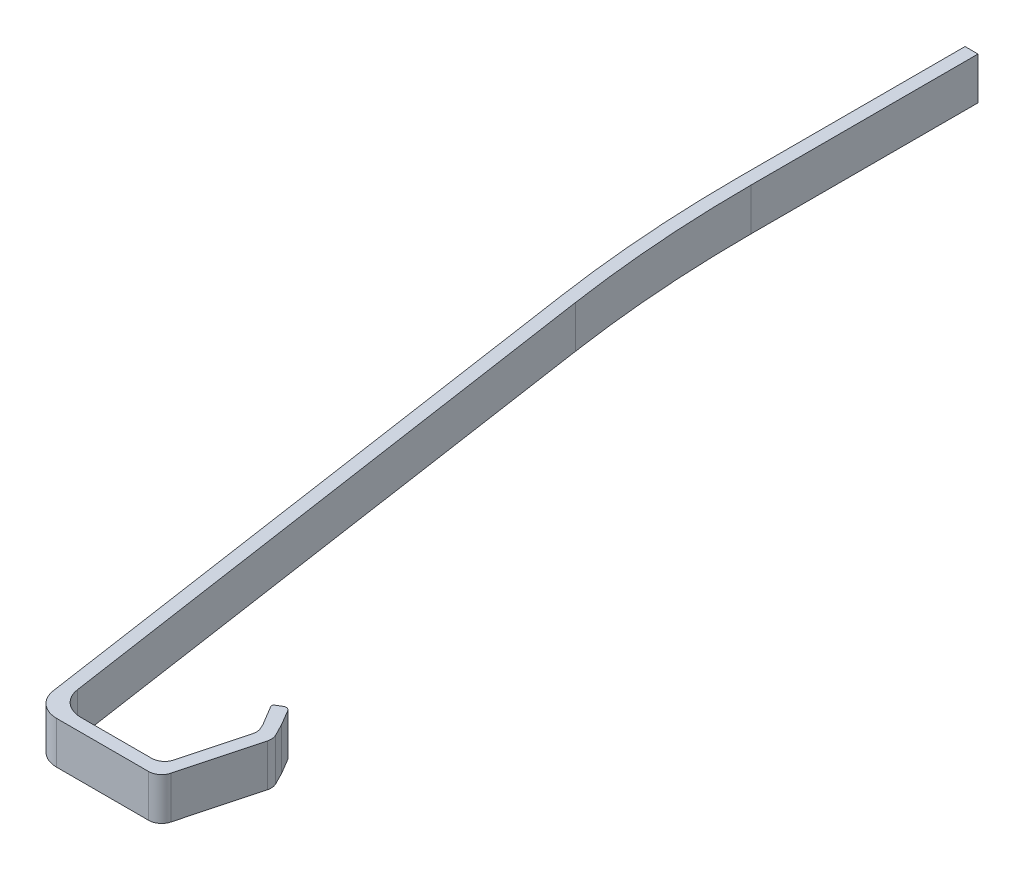
ISO-10303-21;
HEADER;
FILE_DESCRIPTION(('STEP AP214'),'2;1');
FILE_NAME('part.step','',(''),(''),'','','');
FILE_SCHEMA(('AUTOMOTIVE_DESIGN { 1 0 10303 214 1 1 1 1 }'));
ENDSEC;
DATA;
#1=APPLICATION_CONTEXT('core data for automotive mechanical design processes');
#2=APPLICATION_PROTOCOL_DEFINITION('international standard','automotive_design',2000,#1);
#3=PRODUCT_CONTEXT('',#1,'mechanical');
#4=PRODUCT('Part','Part','',(#3));
#5=PRODUCT_RELATED_PRODUCT_CATEGORY('part','',(#4));
#6=PRODUCT_DEFINITION_FORMATION('','',#4);
#7=PRODUCT_DEFINITION_CONTEXT('part definition',#1,'design');
#8=PRODUCT_DEFINITION('design','',#6,#7);
#9=PRODUCT_DEFINITION_SHAPE('','',#8);
#10=(LENGTH_UNIT() NAMED_UNIT(*) SI_UNIT(.MILLI.,.METRE.));
#11=(NAMED_UNIT(*) PLANE_ANGLE_UNIT() SI_UNIT($,.RADIAN.));
#12=(NAMED_UNIT(*) SI_UNIT($,.STERADIAN.) SOLID_ANGLE_UNIT());
#13=UNCERTAINTY_MEASURE_WITH_UNIT(LENGTH_MEASURE(1.E-05),#10,'distance_accuracy_value','');
#14=(GEOMETRIC_REPRESENTATION_CONTEXT(3) GLOBAL_UNCERTAINTY_ASSIGNED_CONTEXT((#13)) GLOBAL_UNIT_ASSIGNED_CONTEXT((#10,
#11,#12)) REPRESENTATION_CONTEXT('',''));
#15=CARTESIAN_POINT('',(0.,0.,0.));
#16=DIRECTION('',(0.,0.,1.));
#17=DIRECTION('',(1.,0.,0.));
#18=AXIS2_PLACEMENT_3D('',#15,#16,#17);
#19=CARTESIAN_POINT('',(63.534236003317,-4.9,267.529669295399));
#20=DIRECTION('',(0.,1.,0.));
#21=DIRECTION('',(0.,0.,1.));
#22=AXIS2_PLACEMENT_3D('',#19,#20,#21);
#23=CYLINDRICAL_SURFACE('',#22,0.500000000000008);
#24=DIRECTION('',(0.,1.,0.));
#25=VECTOR('',#24,1.);
#26=CARTESIAN_POINT('',(63.1054895404607,-4.9,267.786917173113));
#27=LINE('',#26,#25);
#28=CARTESIAN_POINT('',(63.1054895404607,-4.9,267.786917173113));
#29=VERTEX_POINT('',#28);
#30=CARTESIAN_POINT('',(63.1054895404607,4.9,267.786917173113));
#31=VERTEX_POINT('',#30);
#32=EDGE_CURVE('E44',#29,#31,#27,.T.);
#33=ORIENTED_EDGE('',*,*,#32,.T.);
#34=CARTESIAN_POINT('',(63.534236003317,4.9,267.529669295399));
#35=DIRECTION('',(0.,1.,0.));
#36=DIRECTION('',(0.,0.,1.));
#37=AXIS2_PLACEMENT_3D('',#34,#35,#36);
#38=CIRCLE('',#37,0.500000000000008);
#39=CARTESIAN_POINT('',(63.2769881256033,4.9,267.100922832543));
#40=VERTEX_POINT('',#39);
#41=EDGE_CURVE('E209',#31,#40,#38,.F.);
#42=ORIENTED_EDGE('',*,*,#41,.T.);
#43=DIRECTION('',(0.,1.,0.));
#44=VECTOR('',#43,1.);
#45=CARTESIAN_POINT('',(63.2769881256033,-4.9,267.100922832543));
#46=LINE('',#45,#44);
#47=CARTESIAN_POINT('',(63.2769881256033,-4.9,267.100922832543));
#48=VERTEX_POINT('',#47);
#49=EDGE_CURVE('E11',#48,#40,#46,.T.);
#50=ORIENTED_EDGE('',*,*,#49,.F.);
#51=CARTESIAN_POINT('',(63.534236003317,-4.9,267.529669295399));
#52=DIRECTION('',(0.,1.,0.));
#53=DIRECTION('',(0.,0.,1.));
#54=AXIS2_PLACEMENT_3D('',#51,#52,#53);
#55=CIRCLE('',#54,0.500000000000008);
#56=EDGE_CURVE('E211',#29,#48,#55,.F.);
#57=ORIENTED_EDGE('',*,*,#56,.F.);
#58=EDGE_LOOP('',(#33,#42,#50,#57));
#59=FACE_BOUND('',#58,.T.);
#60=ADVANCED_FACE('F41',(#59),#23,.T.);
#61=CARTESIAN_POINT('',(134.588433400539,-4.9,224.314055667585));
#62=DIRECTION('',(0.514495755427491,0.,0.857492925712565));
#63=DIRECTION('',(0.857492925712566,0.,-0.514495755427491));
#64=AXIS2_PLACEMENT_3D('',#61,#62,#63);
#65=PLANE('',#64);
#66=ORIENTED_EDGE('',*,*,#49,.T.);
#67=DIRECTION('',(0.857492925712566,0.,-0.514495755427491));
#68=VECTOR('',#67,1.);
#69=CARTESIAN_POINT('',(134.588433400539,4.9,224.314055667585));
#70=LINE('',#69,#68);
#71=CARTESIAN_POINT('',(64.5571730263446,4.9,266.332811892098));
#72=VERTEX_POINT('',#71);
#73=EDGE_CURVE('E224',#40,#72,#70,.T.);
#74=ORIENTED_EDGE('',*,*,#73,.T.);
#75=DIRECTION('',(0.,1.,0.));
#76=VECTOR('',#75,1.);
#77=CARTESIAN_POINT('',(64.5571730263446,-4.9,266.332811892098));
#78=LINE('',#77,#76);
#79=CARTESIAN_POINT('',(64.5571730263446,-4.9,266.332811892098));
#80=VERTEX_POINT('',#79);
#81=EDGE_CURVE('E49',#80,#72,#78,.T.);
#82=ORIENTED_EDGE('',*,*,#81,.F.);
#83=DIRECTION('',(0.857492925712566,0.,-0.514495755427491));
#84=VECTOR('',#83,1.);
#85=CARTESIAN_POINT('',(134.588433400539,-4.9,224.314055667585));
#86=LINE('',#85,#84);
#87=EDGE_CURVE('E56',#48,#80,#86,.T.);
#88=ORIENTED_EDGE('',*,*,#87,.F.);
#89=EDGE_LOOP('',(#66,#74,#82,#88));
#90=FACE_BOUND('',#89,.T.);
#91=ADVANCED_FACE('F489',(#90),#65,.F.);
#92=CARTESIAN_POINT('',(65.0716687817721,-4.9,267.19030481781));
#93=DIRECTION('',(0.,1.,0.));
#94=DIRECTION('',(0.,0.,1.));
#95=AXIS2_PLACEMENT_3D('',#92,#93,#94);
#96=CYLINDRICAL_SURFACE('',#95,0.99999999999999);
#97=ORIENTED_EDGE('',*,*,#81,.T.);
#98=CARTESIAN_POINT('',(65.0716687817721,4.9,267.19030481781));
#99=DIRECTION('',(0.,1.,0.));
#100=DIRECTION('',(0.,0.,1.));
#101=AXIS2_PLACEMENT_3D('',#98,#99,#100);
#102=CIRCLE('',#101,0.99999999999999);
#103=CARTESIAN_POINT('',(65.9327603518165,4.9,266.681854910741));
#104=VERTEX_POINT('',#103);
#105=EDGE_CURVE('E292',#104,#72,#102,.T.);
#106=ORIENTED_EDGE('',*,*,#105,.F.);
#107=DIRECTION('',(0.,1.,0.));
#108=VECTOR('',#107,1.);
#109=CARTESIAN_POINT('',(65.9327603518165,-4.9,266.681854910741));
#110=LINE('',#109,#108);
#111=CARTESIAN_POINT('',(65.9327603518165,-4.9,266.681854910741));
#112=VERTEX_POINT('',#111);
#113=EDGE_CURVE('E355',#112,#104,#110,.T.);
#114=ORIENTED_EDGE('',*,*,#113,.F.);
#115=CARTESIAN_POINT('',(65.0716687817721,-4.9,267.19030481781));
#116=DIRECTION('',(0.,1.,0.));
#117=DIRECTION('',(0.,0.,1.));
#118=AXIS2_PLACEMENT_3D('',#115,#116,#117);
#119=CIRCLE('',#118,0.99999999999999);
#120=EDGE_CURVE('E350',#112,#80,#119,.T.);
#121=ORIENTED_EDGE('',*,*,#120,.T.);
#122=EDGE_LOOP('',(#97,#106,#114,#121));
#123=FACE_BOUND('',#122,.T.);
#124=ADVANCED_FACE('F488',(#123),#96,.T.);
#125=CARTESIAN_POINT('',(-67.8714271784815,-4.9,40.0761336448447));
#126=DIRECTION('',(0.861091570044339,0.,-0.508449907069099));
#127=DIRECTION('',(-0.508449907069099,0.,-0.861091570044339));
#128=AXIS2_PLACEMENT_3D('',#125,#126,#127);
#129=PLANE('',#128);
#130=ORIENTED_EDGE('',*,*,#113,.T.);
#131=DIRECTION('',(-0.508449907069099,0.,-0.861091570044339));
#132=VECTOR('',#131,1.);
#133=CARTESIAN_POINT('',(-67.8714271784815,4.9,40.0761336448447));
#134=LINE('',#133,#132);
#135=CARTESIAN_POINT('',(67.9984661847248,4.9,270.180256334713));
#136=VERTEX_POINT('',#135);
#137=EDGE_CURVE('E289',#136,#104,#134,.T.);
#138=ORIENTED_EDGE('',*,*,#137,.F.);
#139=DIRECTION('',(0.,1.,0.));
#140=VECTOR('',#139,1.);
#141=CARTESIAN_POINT('',(67.9984661847248,-4.9,270.180256334713));
#142=LINE('',#141,#140);
#143=CARTESIAN_POINT('',(67.9984661847248,-4.9,270.180256334713));
#144=VERTEX_POINT('',#143);
#145=EDGE_CURVE('E357',#144,#136,#142,.T.);
#146=ORIENTED_EDGE('',*,*,#145,.F.);
#147=DIRECTION('',(-0.508449907069099,0.,-0.861091570044339));
#148=VECTOR('',#147,1.);
#149=CARTESIAN_POINT('',(-67.8714271784815,-4.9,40.0761336448447));
#150=LINE('',#149,#148);
#151=EDGE_CURVE('E347',#144,#112,#150,.T.);
#152=ORIENTED_EDGE('',*,*,#151,.T.);
#153=EDGE_LOOP('',(#130,#138,#146,#152));
#154=FACE_BOUND('',#153,.T.);
#155=ADVANCED_FACE('F485',(#154),#129,.T.);
#156=CARTESIAN_POINT('',(-55.1862828881438,-4.9,28.0796879363563));
#157=DIRECTION('',(-0.891261997613539,0.,0.453488755770111));
#158=DIRECTION('',(0.453488755770111,0.,0.89126199761354));
#159=AXIS2_PLACEMENT_3D('',#156,#157,#158);
#160=PLANE('',#159);
#161=ORIENTED_EDGE('',*,*,#145,.T.);
#162=DIRECTION('',(0.453488755770111,0.,0.891261997613539));
#163=VECTOR('',#162,1.);
#164=CARTESIAN_POINT('',(-55.1862828881438,4.9,28.0796879363563));
#165=LINE('',#164,#163);
#166=CARTESIAN_POINT('',(69.4209408448456,4.9,272.975910231315));
#167=VERTEX_POINT('',#166);
#168=EDGE_CURVE('E286',#136,#167,#165,.T.);
#169=ORIENTED_EDGE('',*,*,#168,.T.);
#170=DIRECTION('',(0.,1.,0.));
#171=VECTOR('',#170,1.);
#172=CARTESIAN_POINT('',(69.4209408448456,-4.9,272.975910231315));
#173=LINE('',#172,#171);
#174=CARTESIAN_POINT('',(69.4209408448456,-4.9,272.975910231315));
#175=VERTEX_POINT('',#174);
#176=EDGE_CURVE('E359',#175,#167,#173,.T.);
#177=ORIENTED_EDGE('',*,*,#176,.F.);
#178=DIRECTION('',(0.453488755770111,0.,0.891261997613539));
#179=VECTOR('',#178,1.);
#180=CARTESIAN_POINT('',(-55.1862828881438,-4.9,28.0796879363563));
#181=LINE('',#180,#179);
#182=EDGE_CURVE('E345',#144,#175,#181,.T.);
#183=ORIENTED_EDGE('',*,*,#182,.F.);
#184=EDGE_LOOP('',(#161,#169,#177,#183));
#185=FACE_BOUND('',#184,.T.);
#186=ADVANCED_FACE('F480',(#185),#160,.F.);
#187=CARTESIAN_POINT('',(66.7471548520051,-4.9,274.336376498625));
#188=DIRECTION('',(0.,1.,0.));
#189=DIRECTION('',(0.,0.,1.));
#190=AXIS2_PLACEMENT_3D('',#187,#188,#189);
#191=CYLINDRICAL_SURFACE('',#190,2.99999999999995);
#192=ORIENTED_EDGE('',*,*,#176,.T.);
#193=CARTESIAN_POINT('',(66.7471548520051,4.9,274.336376498625));
#194=DIRECTION('',(0.,1.,0.));
#195=DIRECTION('',(0.,0.,1.));
#196=AXIS2_PLACEMENT_3D('',#193,#194,#195);
#197=CIRCLE('',#196,2.99999999999995);
#198=CARTESIAN_POINT('',(69.6458255608125,4.9,275.109492351459));
#199=VERTEX_POINT('',#198);
#200=EDGE_CURVE('E283',#199,#167,#197,.T.);
#201=ORIENTED_EDGE('',*,*,#200,.F.);
#202=DIRECTION('',(0.,1.,0.));
#203=VECTOR('',#202,1.);
#204=CARTESIAN_POINT('',(69.6458255608125,-4.9,275.109492351459));
#205=LINE('',#204,#203);
#206=CARTESIAN_POINT('',(69.6458255608125,-4.9,275.109492351459));
#207=VERTEX_POINT('',#206);
#208=EDGE_CURVE('E361',#207,#199,#205,.T.);
#209=ORIENTED_EDGE('',*,*,#208,.F.);
#210=CARTESIAN_POINT('',(66.7471548520051,-4.9,274.336376498625));
#211=DIRECTION('',(0.,1.,0.));
#212=DIRECTION('',(0.,0.,1.));
#213=AXIS2_PLACEMENT_3D('',#210,#211,#212);
#214=CIRCLE('',#213,2.99999999999995);
#215=EDGE_CURVE('E342',#207,#175,#214,.T.);
#216=ORIENTED_EDGE('',*,*,#215,.T.);
#217=EDGE_LOOP('',(#192,#201,#209,#216));
#218=FACE_BOUND('',#217,.T.);
#219=ADVANCED_FACE('F504',(#218),#191,.T.);
#220=CARTESIAN_POINT('',(133.523022658624,-4.9,35.6124499488499));
#221=DIRECTION('',(-0.966223569602459,0.,-0.257705284277761));
#222=DIRECTION('',(-0.257705284277761,0.,0.966223569602459));
#223=AXIS2_PLACEMENT_3D('',#220,#221,#222);
#224=PLANE('',#223);
#225=ORIENTED_EDGE('',*,*,#208,.T.);
#226=DIRECTION('',(-0.257705284277761,0.,0.966223569602459));
#227=VECTOR('',#226,1.);
#228=CARTESIAN_POINT('',(133.523022658624,4.9,35.6124499488499));
#229=LINE('',#228,#227);
#230=CARTESIAN_POINT('',(64.9346911411979,4.9,292.773115852833));
#231=VERTEX_POINT('',#230);
#232=EDGE_CURVE('E280',#199,#231,#229,.T.);
#233=ORIENTED_EDGE('',*,*,#232,.T.);
#234=DIRECTION('',(0.,1.,0.));
#235=VECTOR('',#234,1.);
#236=CARTESIAN_POINT('',(64.9346911411979,-4.9,292.773115852833));
#237=LINE('',#236,#235);
#238=CARTESIAN_POINT('',(64.9346911411979,-4.9,292.773115852833));
#239=VERTEX_POINT('',#238);
#240=EDGE_CURVE('E363',#239,#231,#237,.T.);
#241=ORIENTED_EDGE('',*,*,#240,.F.);
#242=DIRECTION('',(-0.257705284277761,0.,0.966223569602459));
#243=VECTOR('',#242,1.);
#244=CARTESIAN_POINT('',(133.523022658624,-4.9,35.6124499488499));
#245=LINE('',#244,#243);
#246=EDGE_CURVE('E340',#207,#239,#245,.T.);
#247=ORIENTED_EDGE('',*,*,#246,.F.);
#248=EDGE_LOOP('',(#225,#233,#241,#247));
#249=FACE_BOUND('',#248,.T.);
#250=ADVANCED_FACE('F473',(#249),#224,.F.);
#251=CARTESIAN_POINT('',(62.0360204323905,-4.9,292.));
#252=DIRECTION('',(0.,1.,0.));
#253=DIRECTION('',(0.,0.,1.));
#254=AXIS2_PLACEMENT_3D('',#251,#252,#253);
#255=CYLINDRICAL_SURFACE('',#254,3.00000000000001);
#256=ORIENTED_EDGE('',*,*,#240,.T.);
#257=CARTESIAN_POINT('',(62.0360204323905,4.9,292.));
#258=DIRECTION('',(0.,1.,0.));
#259=DIRECTION('',(0.,0.,1.));
#260=AXIS2_PLACEMENT_3D('',#257,#258,#259);
#261=CIRCLE('',#260,3.00000000000001);
#262=CARTESIAN_POINT('',(62.0360204323904,4.9,295.));
#263=VERTEX_POINT('',#262);
#264=EDGE_CURVE('E277',#263,#231,#261,.T.);
#265=ORIENTED_EDGE('',*,*,#264,.F.);
#266=DIRECTION('',(0.,1.,0.));
#267=VECTOR('',#266,1.);
#268=CARTESIAN_POINT('',(62.0360204323904,-4.9,295.));
#269=LINE('',#268,#267);
#270=CARTESIAN_POINT('',(62.0360204323904,-4.9,295.));
#271=VERTEX_POINT('',#270);
#272=EDGE_CURVE('E365',#271,#263,#269,.T.);
#273=ORIENTED_EDGE('',*,*,#272,.F.);
#274=CARTESIAN_POINT('',(62.0360204323905,-4.9,292.));
#275=DIRECTION('',(0.,1.,0.));
#276=DIRECTION('',(0.,0.,1.));
#277=AXIS2_PLACEMENT_3D('',#274,#275,#276);
#278=CIRCLE('',#277,3.00000000000001);
#279=EDGE_CURVE('E337',#271,#239,#278,.T.);
#280=ORIENTED_EDGE('',*,*,#279,.T.);
#281=EDGE_LOOP('',(#256,#265,#273,#280));
#282=FACE_BOUND('',#281,.T.);
#283=ADVANCED_FACE('F468',(#282),#255,.T.);
#284=CARTESIAN_POINT('',(0.,-4.9,295.));
#285=DIRECTION('',(0.,0.,1.));
#286=DIRECTION('',(1.,0.,0.));
#287=AXIS2_PLACEMENT_3D('',#284,#285,#286);
#288=PLANE('',#287);
#289=ORIENTED_EDGE('',*,*,#272,.T.);
#290=DIRECTION('',(1.,0.,0.));
#291=VECTOR('',#290,1.);
#292=CARTESIAN_POINT('',(0.,4.9,295.));
#293=LINE('',#292,#291);
#294=CARTESIAN_POINT('',(40.7187262352657,4.9,295.));
#295=VERTEX_POINT('',#294);
#296=EDGE_CURVE('E274',#295,#263,#293,.T.);
#297=ORIENTED_EDGE('',*,*,#296,.F.);
#298=DIRECTION('',(0.,1.,0.));
#299=VECTOR('',#298,1.);
#300=CARTESIAN_POINT('',(40.7187262352657,-4.9,295.));
#301=LINE('',#300,#299);
#302=CARTESIAN_POINT('',(40.7187262352657,-4.9,295.));
#303=VERTEX_POINT('',#302);
#304=EDGE_CURVE('E367',#303,#295,#301,.T.);
#305=ORIENTED_EDGE('',*,*,#304,.F.);
#306=DIRECTION('',(1.,0.,0.));
#307=VECTOR('',#306,1.);
#308=CARTESIAN_POINT('',(0.,-4.9,295.));
#309=LINE('',#308,#307);
#310=EDGE_CURVE('E334',#303,#271,#309,.T.);
#311=ORIENTED_EDGE('',*,*,#310,.T.);
#312=EDGE_LOOP('',(#289,#297,#305,#311));
#313=FACE_BOUND('',#312,.T.);
#314=ADVANCED_FACE('F466',(#313),#288,.T.);
#315=CARTESIAN_POINT('',(40.7187262352656,-4.9,289.));
#316=DIRECTION('',(0.,1.,0.));
#317=DIRECTION('',(0.,0.,1.));
#318=AXIS2_PLACEMENT_3D('',#315,#316,#317);
#319=CYLINDRICAL_SURFACE('',#318,6.00000000000001);
#320=ORIENTED_EDGE('',*,*,#304,.T.);
#321=CARTESIAN_POINT('',(40.7187262352656,4.9,289.));
#322=DIRECTION('',(0.,1.,0.));
#323=DIRECTION('',(0.,0.,1.));
#324=AXIS2_PLACEMENT_3D('',#321,#322,#323);
#325=CIRCLE('',#324,6.00000000000001);
#326=CARTESIAN_POINT('',(34.7831474096627,4.9,289.876871715278));
#327=VERTEX_POINT('',#326);
#328=EDGE_CURVE('E271',#327,#295,#325,.T.);
#329=ORIENTED_EDGE('',*,*,#328,.F.);
#330=DIRECTION('',(0.,1.,0.));
#331=VECTOR('',#330,1.);
#332=CARTESIAN_POINT('',(34.7831474096627,-4.9,289.876871715278));
#333=LINE('',#332,#331);
#334=CARTESIAN_POINT('',(34.7831474096627,-4.9,289.876871715278));
#335=VERTEX_POINT('',#334);
#336=EDGE_CURVE('E369',#335,#327,#333,.T.);
#337=ORIENTED_EDGE('',*,*,#336,.F.);
#338=CARTESIAN_POINT('',(40.7187262352656,-4.9,289.));
#339=DIRECTION('',(0.,1.,0.));
#340=DIRECTION('',(0.,0.,1.));
#341=AXIS2_PLACEMENT_3D('',#338,#339,#340);
#342=CIRCLE('',#341,6.00000000000001);
#343=EDGE_CURVE('E331',#335,#303,#342,.T.);
#344=ORIENTED_EDGE('',*,*,#343,.T.);
#345=EDGE_LOOP('',(#320,#329,#337,#344));
#346=FACE_BOUND('',#345,.T.);
#347=ADVANCED_FACE('F461',(#346),#319,.T.);
#348=CARTESIAN_POINT('',(-7.86904688003991,-4.9,1.16250577037894));
#349=DIRECTION('',(-0.989263137600486,0.,0.146145285879642));
#350=DIRECTION('',(0.146145285879642,0.,0.989263137600486));
#351=AXIS2_PLACEMENT_3D('',#348,#349,#350);
#352=PLANE('',#351);
#353=ORIENTED_EDGE('',*,*,#336,.T.);
#354=DIRECTION('',(0.146145285879642,0.,0.989263137600486));
#355=VECTOR('',#354,1.);
#356=CARTESIAN_POINT('',(-7.86904688003991,4.9,1.16250577037894));
#357=LINE('',#356,#355);
#358=CARTESIAN_POINT('',(14.3929735431843,4.9,151.85498990115));
#359=VERTEX_POINT('',#358);
#360=EDGE_CURVE('E268',#359,#327,#357,.T.);
#361=ORIENTED_EDGE('',*,*,#360,.F.);
#362=DIRECTION('',(0.,1.,0.));
#363=VECTOR('',#362,1.);
#364=CARTESIAN_POINT('',(14.3929735431843,-4.9,151.85498990115));
#365=LINE('',#364,#363);
#366=CARTESIAN_POINT('',(14.3929735431843,-4.9,151.85498990115));
#367=VERTEX_POINT('',#366);
#368=EDGE_CURVE('E371',#367,#359,#365,.T.);
#369=ORIENTED_EDGE('',*,*,#368,.F.);
#370=DIRECTION('',(0.146145285879642,0.,0.989263137600486));
#371=VECTOR('',#370,1.);
#372=CARTESIAN_POINT('',(-7.86904688003991,-4.9,1.16250577037894));
#373=LINE('',#372,#371);
#374=EDGE_CURVE('E328',#367,#335,#373,.T.);
#375=ORIENTED_EDGE('',*,*,#374,.T.);
#376=EDGE_LOOP('',(#353,#361,#369,#375));
#377=FACE_BOUND('',#376,.T.);
#378=ADVANCED_FACE('F455',(#377),#352,.T.);
#379=CARTESIAN_POINT('',(314.139704236131,-4.9,107.572968279617));
#380=DIRECTION('',(0.,1.,0.));
#381=DIRECTION('',(0.,0.,1.));
#382=AXIS2_PLACEMENT_3D('',#379,#380,#381);
#383=CYLINDRICAL_SURFACE('',#382,303.);
#384=ORIENTED_EDGE('',*,*,#368,.T.);
#385=CARTESIAN_POINT('',(314.139704236131,4.9,107.572968279617));
#386=DIRECTION('',(0.,1.,0.));
#387=DIRECTION('',(0.,0.,1.));
#388=AXIS2_PLACEMENT_3D('',#385,#386,#387);
#389=CIRCLE('',#388,303.);
#390=CARTESIAN_POINT('',(11.1397042361314,4.9,107.572968279616));
#391=VERTEX_POINT('',#390);
#392=EDGE_CURVE('E265',#391,#359,#389,.T.);
#393=ORIENTED_EDGE('',*,*,#392,.F.);
#394=DIRECTION('',(0.,1.,0.));
#395=VECTOR('',#394,1.);
#396=CARTESIAN_POINT('',(11.1397042361314,-4.9,107.572968279616));
#397=LINE('',#396,#395);
#398=CARTESIAN_POINT('',(11.1397042361314,-4.9,107.572968279616));
#399=VERTEX_POINT('',#398);
#400=EDGE_CURVE('E373',#399,#391,#397,.T.);
#401=ORIENTED_EDGE('',*,*,#400,.F.);
#402=CARTESIAN_POINT('',(314.139704236131,-4.9,107.572968279617));
#403=DIRECTION('',(0.,1.,0.));
#404=DIRECTION('',(0.,0.,1.));
#405=AXIS2_PLACEMENT_3D('',#402,#403,#404);
#406=CIRCLE('',#405,303.);
#407=EDGE_CURVE('E325',#399,#367,#406,.T.);
#408=ORIENTED_EDGE('',*,*,#407,.T.);
#409=EDGE_LOOP('',(#384,#393,#401,#408));
#410=FACE_BOUND('',#409,.T.);
#411=ADVANCED_FACE('F451',(#410),#383,.T.);
#412=CARTESIAN_POINT('',(11.1397042361314,-4.9,0.));
#413=DIRECTION('',(-1.,0.,0.));
#414=DIRECTION('',(0.,0.,1.));
#415=AXIS2_PLACEMENT_3D('',#412,#413,#414);
#416=PLANE('',#415);
#417=ORIENTED_EDGE('',*,*,#400,.T.);
#418=DIRECTION('',(0.,0.,1.));
#419=VECTOR('',#418,1.);
#420=CARTESIAN_POINT('',(11.1397042361314,4.9,0.));
#421=LINE('',#420,#419);
#422=CARTESIAN_POINT('',(11.1397042361314,4.9,55.));
#423=VERTEX_POINT('',#422);
#424=EDGE_CURVE('E262',#423,#391,#421,.T.);
#425=ORIENTED_EDGE('',*,*,#424,.F.);
#426=DIRECTION('',(0.,1.,0.));
#427=VECTOR('',#426,1.);
#428=CARTESIAN_POINT('',(11.1397042361314,-4.9,55.));
#429=LINE('',#428,#427);
#430=CARTESIAN_POINT('',(11.1397042361314,-4.9,55.));
#431=VERTEX_POINT('',#430);
#432=EDGE_CURVE('E375',#431,#423,#429,.T.);
#433=ORIENTED_EDGE('',*,*,#432,.F.);
#434=DIRECTION('',(0.,0.,1.));
#435=VECTOR('',#434,1.);
#436=CARTESIAN_POINT('',(11.1397042361314,-4.9,0.));
#437=LINE('',#436,#435);
#438=EDGE_CURVE('E322',#431,#399,#437,.T.);
#439=ORIENTED_EDGE('',*,*,#438,.T.);
#440=EDGE_LOOP('',(#417,#425,#433,#439));
#441=FACE_BOUND('',#440,.T.);
#442=ADVANCED_FACE('F519',(#441),#416,.T.);
#443=CARTESIAN_POINT('',(0.,-4.9,55.));
#444=DIRECTION('',(0.,0.,1.));
#445=DIRECTION('',(1.,0.,0.));
#446=AXIS2_PLACEMENT_3D('',#443,#444,#445);
#447=PLANE('',#446);
#448=ORIENTED_EDGE('',*,*,#432,.T.);
#449=DIRECTION('',(1.,0.,0.));
#450=VECTOR('',#449,1.);
#451=CARTESIAN_POINT('',(0.,4.9,55.));
#452=LINE('',#451,#450);
#453=CARTESIAN_POINT('',(14.1397042361314,4.9,55.));
#454=VERTEX_POINT('',#453);
#455=EDGE_CURVE('E259',#423,#454,#452,.T.);
#456=ORIENTED_EDGE('',*,*,#455,.T.);
#457=DIRECTION('',(0.,1.,0.));
#458=VECTOR('',#457,1.);
#459=CARTESIAN_POINT('',(14.1397042361314,-4.9,55.));
#460=LINE('',#459,#458);
#461=CARTESIAN_POINT('',(14.1397042361314,-4.9,55.));
#462=VERTEX_POINT('',#461);
#463=EDGE_CURVE('E377',#462,#454,#460,.T.);
#464=ORIENTED_EDGE('',*,*,#463,.F.);
#465=DIRECTION('',(1.,0.,0.));
#466=VECTOR('',#465,1.);
#467=CARTESIAN_POINT('',(0.,-4.9,55.));
#468=LINE('',#467,#466);
#469=EDGE_CURVE('E320',#431,#462,#468,.T.);
#470=ORIENTED_EDGE('',*,*,#469,.F.);
#471=EDGE_LOOP('',(#448,#456,#464,#470));
#472=FACE_BOUND('',#471,.T.);
#473=ADVANCED_FACE('F444',(#472),#447,.F.);
#474=CARTESIAN_POINT('',(14.1397042361314,-4.9,0.));
#475=DIRECTION('',(-1.,0.,0.));
#476=DIRECTION('',(0.,0.,1.));
#477=AXIS2_PLACEMENT_3D('',#474,#475,#476);
#478=PLANE('',#477);
#479=ORIENTED_EDGE('',*,*,#463,.T.);
#480=DIRECTION('',(0.,0.,1.));
#481=VECTOR('',#480,1.);
#482=CARTESIAN_POINT('',(14.1397042361314,4.9,0.));
#483=LINE('',#482,#481);
#484=CARTESIAN_POINT('',(14.1397042361314,4.9,107.572968279616));
#485=VERTEX_POINT('',#484);
#486=EDGE_CURVE('E256',#454,#485,#483,.T.);
#487=ORIENTED_EDGE('',*,*,#486,.T.);
#488=DIRECTION('',(0.,1.,0.));
#489=VECTOR('',#488,1.);
#490=CARTESIAN_POINT('',(14.1397042361314,-4.9,107.572968279616));
#491=LINE('',#490,#489);
#492=CARTESIAN_POINT('',(14.1397042361314,-4.9,107.572968279616));
#493=VERTEX_POINT('',#492);
#494=EDGE_CURVE('E379',#493,#485,#491,.T.);
#495=ORIENTED_EDGE('',*,*,#494,.F.);
#496=DIRECTION('',(0.,0.,1.));
#497=VECTOR('',#496,1.);
#498=CARTESIAN_POINT('',(14.1397042361314,-4.9,0.));
#499=LINE('',#498,#497);
#500=EDGE_CURVE('E318',#462,#493,#499,.T.);
#501=ORIENTED_EDGE('',*,*,#500,.F.);
#502=EDGE_LOOP('',(#479,#487,#495,#501));
#503=FACE_BOUND('',#502,.T.);
#504=ADVANCED_FACE('F439',(#503),#478,.F.);
#505=CARTESIAN_POINT('',(314.139704236131,-4.9,107.572968279617));
#506=DIRECTION('',(0.,1.,0.));
#507=DIRECTION('',(0.,0.,1.));
#508=AXIS2_PLACEMENT_3D('',#505,#506,#507);
#509=CYLINDRICAL_SURFACE('',#508,300.);
#510=ORIENTED_EDGE('',*,*,#494,.T.);
#511=CARTESIAN_POINT('',(314.139704236131,4.9,107.572968279617));
#512=DIRECTION('',(0.,1.,0.));
#513=DIRECTION('',(0.,0.,1.));
#514=AXIS2_PLACEMENT_3D('',#511,#512,#513);
#515=CIRCLE('',#514,300.);
#516=CARTESIAN_POINT('',(17.3607629559858,4.9,151.416554043511));
#517=VERTEX_POINT('',#516);
#518=EDGE_CURVE('E253',#485,#517,#515,.T.);
#519=ORIENTED_EDGE('',*,*,#518,.T.);
#520=DIRECTION('',(0.,1.,0.));
#521=VECTOR('',#520,1.);
#522=CARTESIAN_POINT('',(17.3607629559858,-4.9,151.416554043511));
#523=LINE('',#522,#521);
#524=CARTESIAN_POINT('',(17.3607629559858,-4.9,151.416554043511));
#525=VERTEX_POINT('',#524);
#526=EDGE_CURVE('E381',#525,#517,#523,.T.);
#527=ORIENTED_EDGE('',*,*,#526,.F.);
#528=CARTESIAN_POINT('',(314.139704236131,-4.9,107.572968279617));
#529=DIRECTION('',(0.,1.,0.));
#530=DIRECTION('',(0.,0.,1.));
#531=AXIS2_PLACEMENT_3D('',#528,#529,#530);
#532=CIRCLE('',#531,300.);
#533=EDGE_CURVE('E316',#493,#525,#532,.T.);
#534=ORIENTED_EDGE('',*,*,#533,.F.);
#535=EDGE_LOOP('',(#510,#519,#527,#534));
#536=FACE_BOUND('',#535,.T.);
#537=ADVANCED_FACE('F434',(#536),#509,.F.);
#538=CARTESIAN_POINT('',(-4.90125746723844,-4.9,0.724069912740009));
#539=DIRECTION('',(-0.989263137600486,0.,0.146145285879642));
#540=DIRECTION('',(0.146145285879642,0.,0.989263137600486));
#541=AXIS2_PLACEMENT_3D('',#538,#539,#540);
#542=PLANE('',#541);
#543=ORIENTED_EDGE('',*,*,#526,.T.);
#544=DIRECTION('',(0.146145285879642,0.,0.989263137600486));
#545=VECTOR('',#544,1.);
#546=CARTESIAN_POINT('',(-4.90125746723844,4.9,0.724069912740009));
#547=LINE('',#546,#545);
#548=CARTESIAN_POINT('',(37.3725132163927,4.9,286.876871715278));
#549=VERTEX_POINT('',#548);
#550=EDGE_CURVE('E250',#517,#549,#547,.T.);
#551=ORIENTED_EDGE('',*,*,#550,.T.);
#552=DIRECTION('',(0.,1.,0.));
#553=VECTOR('',#552,1.);
#554=CARTESIAN_POINT('',(37.3725132163927,-4.9,286.876871715278));
#555=LINE('',#554,#553);
#556=CARTESIAN_POINT('',(37.3725132163927,-4.9,286.876871715278));
#557=VERTEX_POINT('',#556);
#558=EDGE_CURVE('E383',#557,#549,#555,.T.);
#559=ORIENTED_EDGE('',*,*,#558,.F.);
#560=DIRECTION('',(0.146145285879642,0.,0.989263137600486));
#561=VECTOR('',#560,1.);
#562=CARTESIAN_POINT('',(-4.90125746723844,-4.9,0.724069912740009));
#563=LINE('',#562,#561);
#564=EDGE_CURVE('E314',#525,#557,#563,.T.);
#565=ORIENTED_EDGE('',*,*,#564,.F.);
#566=EDGE_LOOP('',(#543,#551,#559,#565));
#567=FACE_BOUND('',#566,.T.);
#568=ADVANCED_FACE('F429',(#567),#542,.F.);
#569=CARTESIAN_POINT('',(43.3080920419956,-4.9,286.));
#570=DIRECTION('',(0.,1.,0.));
#571=DIRECTION('',(0.,0.,1.));
#572=AXIS2_PLACEMENT_3D('',#569,#570,#571);
#573=CYLINDRICAL_SURFACE('',#572,6.);
#574=ORIENTED_EDGE('',*,*,#558,.T.);
#575=CARTESIAN_POINT('',(43.3080920419956,4.9,286.));
#576=DIRECTION('',(0.,1.,0.));
#577=DIRECTION('',(0.,0.,1.));
#578=AXIS2_PLACEMENT_3D('',#575,#576,#577);
#579=CIRCLE('',#578,6.);
#580=CARTESIAN_POINT('',(43.3080920419956,4.9,292.));
#581=VERTEX_POINT('',#580);
#582=EDGE_CURVE('E247',#581,#549,#579,.F.);
#583=ORIENTED_EDGE('',*,*,#582,.F.);
#584=DIRECTION('',(0.,1.,0.));
#585=VECTOR('',#584,1.);
#586=CARTESIAN_POINT('',(43.3080920419956,-4.9,292.));
#587=LINE('',#586,#585);
#588=CARTESIAN_POINT('',(43.3080920419956,-4.9,292.));
#589=VERTEX_POINT('',#588);
#590=EDGE_CURVE('E385',#589,#581,#587,.T.);
#591=ORIENTED_EDGE('',*,*,#590,.F.);
#592=CARTESIAN_POINT('',(43.3080920419956,-4.9,286.));
#593=DIRECTION('',(0.,1.,0.));
#594=DIRECTION('',(0.,0.,1.));
#595=AXIS2_PLACEMENT_3D('',#592,#593,#594);
#596=CIRCLE('',#595,6.);
#597=EDGE_CURVE('E311',#589,#557,#596,.F.);
#598=ORIENTED_EDGE('',*,*,#597,.T.);
#599=EDGE_LOOP('',(#574,#583,#591,#598));
#600=FACE_BOUND('',#599,.T.);
#601=ADVANCED_FACE('F530',(#600),#573,.F.);
#602=CARTESIAN_POINT('',(0.,-4.9,292.));
#603=DIRECTION('',(0.,0.,1.));
#604=DIRECTION('',(1.,0.,0.));
#605=AXIS2_PLACEMENT_3D('',#602,#603,#604);
#606=PLANE('',#605);
#607=ORIENTED_EDGE('',*,*,#590,.T.);
#608=DIRECTION('',(1.,0.,0.));
#609=VECTOR('',#608,1.);
#610=CARTESIAN_POINT('',(0.,4.9,292.));
#611=LINE('',#610,#609);
#612=CARTESIAN_POINT('',(59.7312907432948,4.9,292.));
#613=VERTEX_POINT('',#612);
#614=EDGE_CURVE('E244',#581,#613,#611,.T.);
#615=ORIENTED_EDGE('',*,*,#614,.T.);
#616=DIRECTION('',(0.,1.,0.));
#617=VECTOR('',#616,1.);
#618=CARTESIAN_POINT('',(59.7312907432948,-4.9,292.));
#619=LINE('',#618,#617);
#620=CARTESIAN_POINT('',(59.7312907432948,-4.9,292.));
#621=VERTEX_POINT('',#620);
#622=EDGE_CURVE('E387',#621,#613,#619,.T.);
#623=ORIENTED_EDGE('',*,*,#622,.F.);
#624=DIRECTION('',(1.,0.,0.));
#625=VECTOR('',#624,1.);
#626=CARTESIAN_POINT('',(0.,-4.9,292.));
#627=LINE('',#626,#625);
#628=EDGE_CURVE('E309',#589,#621,#627,.T.);
#629=ORIENTED_EDGE('',*,*,#628,.F.);
#630=EDGE_LOOP('',(#607,#615,#623,#629));
#631=FACE_BOUND('',#630,.T.);
#632=ADVANCED_FACE('F421',(#631),#606,.F.);
#633=CARTESIAN_POINT('',(59.7312907432949,-4.9,289.));
#634=DIRECTION('',(0.,1.,0.));
#635=DIRECTION('',(0.,0.,1.));
#636=AXIS2_PLACEMENT_3D('',#633,#634,#635);
#637=CYLINDRICAL_SURFACE('',#636,3.00000000000001);
#638=ORIENTED_EDGE('',*,*,#622,.T.);
#639=CARTESIAN_POINT('',(59.7312907432949,4.9,289.));
#640=DIRECTION('',(0.,1.,0.));
#641=DIRECTION('',(0.,0.,1.));
#642=AXIS2_PLACEMENT_3D('',#639,#640,#641);
#643=CIRCLE('',#642,3.00000000000001);
#644=CARTESIAN_POINT('',(62.6299614521023,4.9,289.773115852833));
#645=VERTEX_POINT('',#644);
#646=EDGE_CURVE('E241',#613,#645,#643,.T.);
#647=ORIENTED_EDGE('',*,*,#646,.T.);
#648=DIRECTION('',(0.,1.,0.));
#649=VECTOR('',#648,1.);
#650=CARTESIAN_POINT('',(62.6299614521023,-4.9,289.773115852833));
#651=LINE('',#650,#649);
#652=CARTESIAN_POINT('',(62.6299614521023,-4.9,289.773115852833));
#653=VERTEX_POINT('',#652);
#654=EDGE_CURVE('E389',#653,#645,#651,.T.);
#655=ORIENTED_EDGE('',*,*,#654,.F.);
#656=CARTESIAN_POINT('',(59.7312907432949,-4.9,289.));
#657=DIRECTION('',(0.,1.,0.));
#658=DIRECTION('',(0.,0.,1.));
#659=AXIS2_PLACEMENT_3D('',#656,#657,#658);
#660=CIRCLE('',#659,3.00000000000001);
#661=EDGE_CURVE('E307',#621,#653,#660,.T.);
#662=ORIENTED_EDGE('',*,*,#661,.F.);
#663=EDGE_LOOP('',(#638,#647,#655,#662));
#664=FACE_BOUND('',#663,.T.);
#665=ADVANCED_FACE('F416',(#664),#637,.F.);
#666=CARTESIAN_POINT('',(130.624351949817,-4.9,34.8393340960166));
#667=DIRECTION('',(-0.966223569602459,0.,-0.257705284277761));
#668=DIRECTION('',(-0.257705284277761,0.,0.966223569602459));
#669=AXIS2_PLACEMENT_3D('',#666,#667,#668);
#670=PLANE('',#669);
#671=ORIENTED_EDGE('',*,*,#654,.T.);
#672=DIRECTION('',(-0.257705284277761,0.,0.966223569602459));
#673=VECTOR('',#672,1.);
#674=CARTESIAN_POINT('',(130.624351949817,4.9,34.8393340960166));
#675=LINE('',#674,#673);
#676=CARTESIAN_POINT('',(66.4728383350662,4.9,275.364881152461));
#677=VERTEX_POINT('',#676);
#678=EDGE_CURVE('E238',#677,#645,#675,.T.);
#679=ORIENTED_EDGE('',*,*,#678,.F.);
#680=DIRECTION('',(0.,1.,0.));
#681=VECTOR('',#680,1.);
#682=CARTESIAN_POINT('',(66.4728383350662,-4.9,275.364881152461));
#683=LINE('',#682,#681);
#684=CARTESIAN_POINT('',(66.4728383350662,-4.9,275.364881152461));
#685=VERTEX_POINT('',#684);
#686=EDGE_CURVE('E391',#685,#677,#683,.T.);
#687=ORIENTED_EDGE('',*,*,#686,.F.);
#688=DIRECTION('',(-0.257705284277761,0.,0.966223569602459));
#689=VECTOR('',#688,1.);
#690=CARTESIAN_POINT('',(130.624351949817,-4.9,34.8393340960166));
#691=LINE('',#690,#689);
#692=EDGE_CURVE('E304',#685,#653,#691,.T.);
#693=ORIENTED_EDGE('',*,*,#692,.T.);
#694=EDGE_LOOP('',(#671,#679,#687,#693));
#695=FACE_BOUND('',#694,.T.);
#696=ADVANCED_FACE('F537',(#695),#670,.T.);
#697=CARTESIAN_POINT('',(63.5741676262588,-4.9,274.591765299627));
#698=DIRECTION('',(0.,1.,0.));
#699=DIRECTION('',(0.,0.,1.));
#700=AXIS2_PLACEMENT_3D('',#697,#698,#699);
#701=CYLINDRICAL_SURFACE('',#700,2.99999999999999);
#702=ORIENTED_EDGE('',*,*,#686,.T.);
#703=CARTESIAN_POINT('',(63.5741676262588,4.9,274.591765299627));
#704=DIRECTION('',(0.,1.,0.));
#705=DIRECTION('',(0.,0.,1.));
#706=AXIS2_PLACEMENT_3D('',#703,#704,#705);
#707=CIRCLE('',#706,2.99999999999999);
#708=CARTESIAN_POINT('',(66.3118699333936,4.9,273.364986559386));
#709=VERTEX_POINT('',#708);
#710=EDGE_CURVE('E235',#677,#709,#707,.T.);
#711=ORIENTED_EDGE('',*,*,#710,.T.);
#712=DIRECTION('',(0.,1.,0.));
#713=VECTOR('',#712,1.);
#714=CARTESIAN_POINT('',(66.3118699333936,-4.9,273.364986559386));
#715=LINE('',#714,#713);
#716=CARTESIAN_POINT('',(66.3118699333936,-4.9,273.364986559386));
#717=VERTEX_POINT('',#716);
#718=EDGE_CURVE('E393',#717,#709,#715,.T.);
#719=ORIENTED_EDGE('',*,*,#718,.F.);
#720=CARTESIAN_POINT('',(63.5741676262588,-4.9,274.591765299627));
#721=DIRECTION('',(0.,1.,0.));
#722=DIRECTION('',(0.,0.,1.));
#723=AXIS2_PLACEMENT_3D('',#720,#721,#722);
#724=CIRCLE('',#723,2.99999999999999);
#725=EDGE_CURVE('E302',#685,#717,#724,.T.);
#726=ORIENTED_EDGE('',*,*,#725,.F.);
#727=EDGE_LOOP('',(#702,#711,#719,#726));
#728=FACE_BOUND('',#727,.T.);
#729=ADVANCED_FACE('F408',(#728),#701,.F.);
#730=CARTESIAN_POINT('',(-46.7892167378429,-4.9,20.9664930394182));
#731=DIRECTION('',(0.912567435711604,0.,-0.408926246747194));
#732=DIRECTION('',(-0.408926246747194,0.,-0.912567435711604));
#733=AXIS2_PLACEMENT_3D('',#730,#731,#732);
#734=PLANE('',#733);
#735=ORIENTED_EDGE('',*,*,#718,.T.);
#736=DIRECTION('',(-0.408926246747194,0.,-0.912567435711604));
#737=VECTOR('',#736,1.);
#738=CARTESIAN_POINT('',(-46.7892167378429,4.9,20.9664930394182));
#739=LINE('',#738,#737);
#740=CARTESIAN_POINT('',(65.9706620133125,4.9,272.603540603912));
#741=VERTEX_POINT('',#740);
#742=EDGE_CURVE('E230',#709,#741,#739,.T.);
#743=ORIENTED_EDGE('',*,*,#742,.T.);
#744=DIRECTION('',(0.,1.,0.));
#745=VECTOR('',#744,1.);
#746=CARTESIAN_POINT('',(65.9706620133125,-4.9,272.603540603912));
#747=LINE('',#746,#745);
#748=CARTESIAN_POINT('',(65.9706620133125,-4.9,272.603540603912));
#749=VERTEX_POINT('',#748);
#750=EDGE_CURVE('E395',#749,#741,#747,.T.);
#751=ORIENTED_EDGE('',*,*,#750,.F.);
#752=DIRECTION('',(-0.408926246747194,0.,-0.912567435711604));
#753=VECTOR('',#752,1.);
#754=CARTESIAN_POINT('',(-46.7892167378429,-4.9,20.9664930394182));
#755=LINE('',#754,#753);
#756=EDGE_CURVE('E300',#717,#749,#755,.T.);
#757=ORIENTED_EDGE('',*,*,#756,.F.);
#758=EDGE_LOOP('',(#735,#743,#751,#757));
#759=FACE_BOUND('',#758,.T.);
#760=ADVANCED_FACE('F404',(#759),#734,.F.);
#761=CARTESIAN_POINT('',(63.2329597061777,-4.9,273.830319344153));
#762=DIRECTION('',(0.,1.,0.));
#763=DIRECTION('',(0.,0.,1.));
#764=AXIS2_PLACEMENT_3D('',#761,#762,#763);
#765=CYLINDRICAL_SURFACE('',#764,3.);
#766=ORIENTED_EDGE('',*,*,#750,.T.);
#767=CARTESIAN_POINT('',(63.2329597061777,4.9,273.830319344153));
#768=DIRECTION('',(0.,1.,0.));
#769=DIRECTION('',(0.,0.,1.));
#770=AXIS2_PLACEMENT_3D('',#767,#768,#769);
#771=CIRCLE('',#770,3.);
#772=CARTESIAN_POINT('',(65.8054384833154,4.9,272.286832077871));
#773=VERTEX_POINT('',#772);
#774=EDGE_CURVE('E228',#741,#773,#771,.T.);
#775=ORIENTED_EDGE('',*,*,#774,.T.);
#776=DIRECTION('',(0.,1.,0.));
#777=VECTOR('',#776,1.);
#778=CARTESIAN_POINT('',(65.8054384833154,-4.9,272.286832077871));
#779=LINE('',#778,#777);
#780=CARTESIAN_POINT('',(65.8054384833154,-4.9,272.286832077871));
#781=VERTEX_POINT('',#780);
#782=EDGE_CURVE('E215',#781,#773,#779,.T.);
#783=ORIENTED_EDGE('',*,*,#782,.F.);
#784=CARTESIAN_POINT('',(63.2329597061777,-4.9,273.830319344153));
#785=DIRECTION('',(0.,1.,0.));
#786=DIRECTION('',(0.,0.,1.));
#787=AXIS2_PLACEMENT_3D('',#784,#785,#786);
#788=CIRCLE('',#787,3.);
#789=EDGE_CURVE('E298',#749,#781,#788,.T.);
#790=ORIENTED_EDGE('',*,*,#789,.F.);
#791=EDGE_LOOP('',(#766,#775,#783,#790));
#792=FACE_BOUND('',#791,.T.);
#793=ADVANCED_FACE('F399',(#792),#765,.F.);
#794=CARTESIAN_POINT('',(-71.7401917377941,-4.9,43.0441150426737));
#795=DIRECTION('',(0.857492925712559,0.,-0.514495755427502));
#796=DIRECTION('',(-0.514495755427503,0.,-0.857492925712559));
#797=AXIS2_PLACEMENT_3D('',#794,#795,#796);
#798=PLANE('',#797);
#799=ORIENTED_EDGE('',*,*,#782,.T.);
#800=DIRECTION('',(-0.514495755427503,0.,-0.857492925712559));
#801=VECTOR('',#800,1.);
#802=CARTESIAN_POINT('',(-71.7401917377941,4.9,43.0441150426737));
#803=LINE('',#802,#801);
#804=EDGE_CURVE('E220',#773,#31,#803,.T.);
#805=ORIENTED_EDGE('',*,*,#804,.T.);
#806=ORIENTED_EDGE('',*,*,#32,.F.);
#807=DIRECTION('',(-0.514495755427503,0.,-0.857492925712559));
#808=VECTOR('',#807,1.);
#809=CARTESIAN_POINT('',(-71.7401917377941,-4.9,43.0441150426737));
#810=LINE('',#809,#808);
#811=EDGE_CURVE('E296',#781,#29,#810,.T.);
#812=ORIENTED_EDGE('',*,*,#811,.F.);
#813=EDGE_LOOP('',(#799,#805,#806,#812));
#814=FACE_BOUND('',#813,.T.);
#815=ADVANCED_FACE('F226',(#814),#798,.F.);
#816=CARTESIAN_POINT('',(0.,-4.9,0.));
#817=DIRECTION('',(0.,1.,0.));
#818=DIRECTION('',(0.,0.,1.));
#819=AXIS2_PLACEMENT_3D('',#816,#817,#818);
#820=PLANE('',#819);
#821=ORIENTED_EDGE('',*,*,#56,.T.);
#822=ORIENTED_EDGE('',*,*,#87,.T.);
#823=ORIENTED_EDGE('',*,*,#120,.F.);
#824=ORIENTED_EDGE('',*,*,#151,.F.);
#825=ORIENTED_EDGE('',*,*,#182,.T.);
#826=ORIENTED_EDGE('',*,*,#215,.F.);
#827=ORIENTED_EDGE('',*,*,#246,.T.);
#828=ORIENTED_EDGE('',*,*,#279,.F.);
#829=ORIENTED_EDGE('',*,*,#310,.F.);
#830=ORIENTED_EDGE('',*,*,#343,.F.);
#831=ORIENTED_EDGE('',*,*,#374,.F.);
#832=ORIENTED_EDGE('',*,*,#407,.F.);
#833=ORIENTED_EDGE('',*,*,#438,.F.);
#834=ORIENTED_EDGE('',*,*,#469,.T.);
#835=ORIENTED_EDGE('',*,*,#500,.T.);
#836=ORIENTED_EDGE('',*,*,#533,.T.);
#837=ORIENTED_EDGE('',*,*,#564,.T.);
#838=ORIENTED_EDGE('',*,*,#597,.F.);
#839=ORIENTED_EDGE('',*,*,#628,.T.);
#840=ORIENTED_EDGE('',*,*,#661,.T.);
#841=ORIENTED_EDGE('',*,*,#692,.F.);
#842=ORIENTED_EDGE('',*,*,#725,.T.);
#843=ORIENTED_EDGE('',*,*,#756,.T.);
#844=ORIENTED_EDGE('',*,*,#789,.T.);
#845=ORIENTED_EDGE('',*,*,#811,.T.);
#846=EDGE_LOOP('',(#821,#822,#823,#824,#825,#826,#827,#828,#829,#830,#831,#832,#833,#834,#835,
#836,#837,#838,#839,#840,#841,#842,#843,#844,#845));
#847=FACE_BOUND('',#846,.T.);
#848=ADVANCED_FACE('F457',(#847),#820,.F.);
#849=CARTESIAN_POINT('',(0.,4.9,0.));
#850=DIRECTION('',(0.,1.,0.));
#851=DIRECTION('',(0.,0.,1.));
#852=AXIS2_PLACEMENT_3D('',#849,#850,#851);
#853=PLANE('',#852);
#854=ORIENTED_EDGE('',*,*,#41,.F.);
#855=ORIENTED_EDGE('',*,*,#804,.F.);
#856=ORIENTED_EDGE('',*,*,#774,.F.);
#857=ORIENTED_EDGE('',*,*,#742,.F.);
#858=ORIENTED_EDGE('',*,*,#710,.F.);
#859=ORIENTED_EDGE('',*,*,#678,.T.);
#860=ORIENTED_EDGE('',*,*,#646,.F.);
#861=ORIENTED_EDGE('',*,*,#614,.F.);
#862=ORIENTED_EDGE('',*,*,#582,.T.);
#863=ORIENTED_EDGE('',*,*,#550,.F.);
#864=ORIENTED_EDGE('',*,*,#518,.F.);
#865=ORIENTED_EDGE('',*,*,#486,.F.);
#866=ORIENTED_EDGE('',*,*,#455,.F.);
#867=ORIENTED_EDGE('',*,*,#424,.T.);
#868=ORIENTED_EDGE('',*,*,#392,.T.);
#869=ORIENTED_EDGE('',*,*,#360,.T.);
#870=ORIENTED_EDGE('',*,*,#328,.T.);
#871=ORIENTED_EDGE('',*,*,#296,.T.);
#872=ORIENTED_EDGE('',*,*,#264,.T.);
#873=ORIENTED_EDGE('',*,*,#232,.F.);
#874=ORIENTED_EDGE('',*,*,#200,.T.);
#875=ORIENTED_EDGE('',*,*,#168,.F.);
#876=ORIENTED_EDGE('',*,*,#137,.T.);
#877=ORIENTED_EDGE('',*,*,#105,.T.);
#878=ORIENTED_EDGE('',*,*,#73,.F.);
#879=EDGE_LOOP('',(#854,#855,#856,#857,#858,#859,#860,#861,#862,#863,#864,#865,#866,#867,#868,
#869,#870,#871,#872,#873,#874,#875,#876,#877,#878));
#880=FACE_BOUND('',#879,.T.);
#881=ADVANCED_FACE('F218',(#880),#853,.T.);
#882=CLOSED_SHELL('',(#60,#91,#124,#155,#186,#219,#250,#283,#314,#347,#378,#411,#442,#473,#504,
#537,#568,#601,#632,#665,#696,#729,#760,#793,#815,#848,#881));
#883=MANIFOLD_SOLID_BREP('B2',#882);
#884=ADVANCED_BREP_SHAPE_REPRESENTATION('',(#18,#883),#14);
#885=SHAPE_DEFINITION_REPRESENTATION(#9,#884);
ENDSEC;
END-ISO-10303-21;
